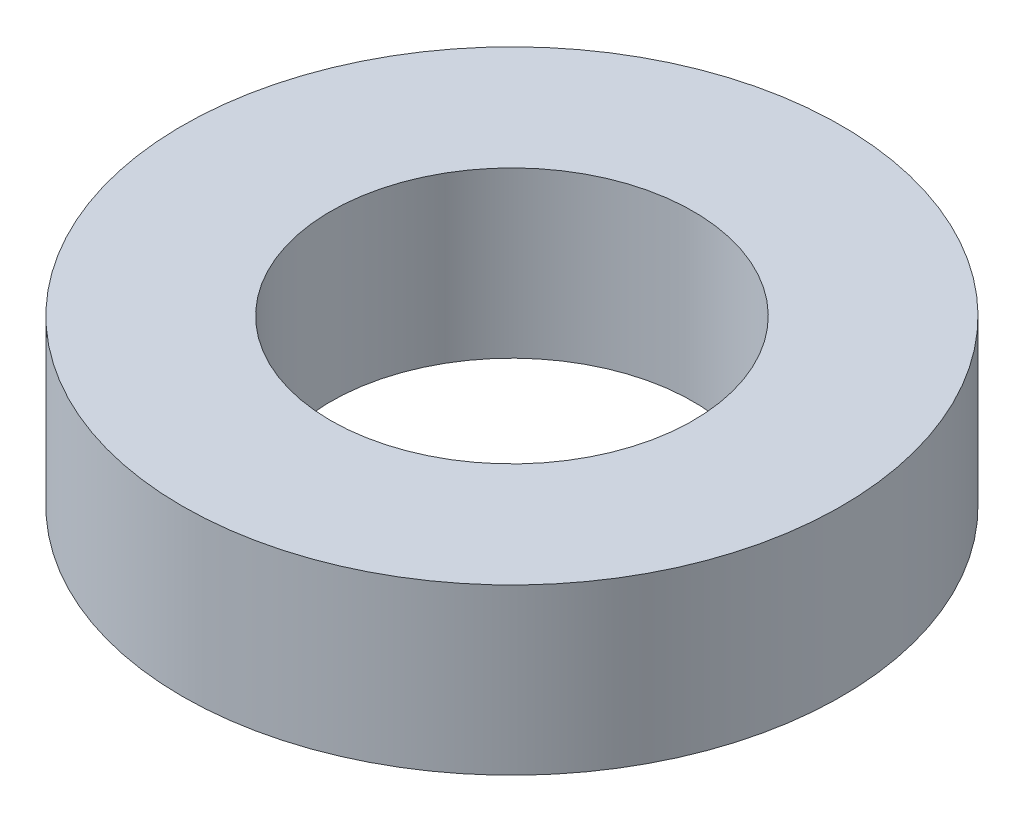
ISO-10303-21;
HEADER;
FILE_DESCRIPTION(('STEP AP214'),'2;1');
FILE_NAME('part.step','',(''),(''),'','','');
FILE_SCHEMA(('AUTOMOTIVE_DESIGN { 1 0 10303 214 1 1 1 1 }'));
ENDSEC;
DATA;
#1=APPLICATION_CONTEXT('core data for automotive mechanical design processes');
#2=APPLICATION_PROTOCOL_DEFINITION('international standard','automotive_design',2000,#1);
#3=PRODUCT_CONTEXT('',#1,'mechanical');
#4=PRODUCT('Part','Part','',(#3));
#5=PRODUCT_RELATED_PRODUCT_CATEGORY('part','',(#4));
#6=PRODUCT_DEFINITION_FORMATION('','',#4);
#7=PRODUCT_DEFINITION_CONTEXT('part definition',#1,'design');
#8=PRODUCT_DEFINITION('design','',#6,#7);
#9=PRODUCT_DEFINITION_SHAPE('','',#8);
#10=(LENGTH_UNIT() NAMED_UNIT(*) SI_UNIT(.MILLI.,.METRE.));
#11=(NAMED_UNIT(*) PLANE_ANGLE_UNIT() SI_UNIT($,.RADIAN.));
#12=(NAMED_UNIT(*) SI_UNIT($,.STERADIAN.) SOLID_ANGLE_UNIT());
#13=UNCERTAINTY_MEASURE_WITH_UNIT(LENGTH_MEASURE(1.E-05),#10,'distance_accuracy_value','');
#14=(GEOMETRIC_REPRESENTATION_CONTEXT(3) GLOBAL_UNCERTAINTY_ASSIGNED_CONTEXT((#13)) GLOBAL_UNIT_ASSIGNED_CONTEXT((#10,
#11,#12)) REPRESENTATION_CONTEXT('',''));
#15=CARTESIAN_POINT('',(0.,0.,0.));
#16=DIRECTION('',(0.,0.,1.));
#17=DIRECTION('',(1.,0.,0.));
#18=AXIS2_PLACEMENT_3D('',#15,#16,#17);
#19=CARTESIAN_POINT('',(0.,0.5,0.));
#20=DIRECTION('',(0.,1.,0.));
#21=DIRECTION('',(0.,0.,1.));
#22=AXIS2_PLACEMENT_3D('',#19,#20,#21);
#23=PLANE('',#22);
#24=CARTESIAN_POINT('',(0.,0.5,0.));
#25=DIRECTION('',(0.,1.,0.));
#26=DIRECTION('',(0.,0.,1.));
#27=AXIS2_PLACEMENT_3D('',#24,#25,#26);
#28=CIRCLE('',#27,2.);
#29=CARTESIAN_POINT('',(0.,0.5,2.));
#30=VERTEX_POINT('',#29);
#31=EDGE_CURVE('E10',#30,#30,#28,.T.);
#32=ORIENTED_EDGE('',*,*,#31,.T.);
#33=EDGE_LOOP('',(#32));
#34=FACE_BOUND('',#33,.T.);
#35=CARTESIAN_POINT('',(0.,0.5,0.));
#36=DIRECTION('',(0.,1.,0.));
#37=DIRECTION('',(0.,0.,1.));
#38=AXIS2_PLACEMENT_3D('',#35,#36,#37);
#39=CIRCLE('',#38,1.1);
#40=CARTESIAN_POINT('',(0.,0.5,1.1));
#41=VERTEX_POINT('',#40);
#42=EDGE_CURVE('E50',#41,#41,#39,.T.);
#43=ORIENTED_EDGE('',*,*,#42,.F.);
#44=EDGE_LOOP('',(#43));
#45=FACE_BOUND('',#44,.T.);
#46=ADVANCED_FACE('F37',(#34,#45),#23,.T.);
#47=CARTESIAN_POINT('',(0.,-0.5,0.));
#48=DIRECTION('',(0.,1.,0.));
#49=DIRECTION('',(0.,0.,1.));
#50=AXIS2_PLACEMENT_3D('',#47,#48,#49);
#51=PLANE('',#50);
#52=CARTESIAN_POINT('',(0.,-0.5,0.));
#53=DIRECTION('',(0.,1.,0.));
#54=DIRECTION('',(0.,0.,1.));
#55=AXIS2_PLACEMENT_3D('',#52,#53,#54);
#56=CIRCLE('',#55,2.);
#57=CARTESIAN_POINT('',(0.,-0.5,2.));
#58=VERTEX_POINT('',#57);
#59=EDGE_CURVE('E41',#58,#58,#56,.T.);
#60=ORIENTED_EDGE('',*,*,#59,.F.);
#61=EDGE_LOOP('',(#60));
#62=FACE_BOUND('',#61,.T.);
#63=CARTESIAN_POINT('',(0.,-0.5,0.));
#64=DIRECTION('',(0.,1.,0.));
#65=DIRECTION('',(0.,0.,1.));
#66=AXIS2_PLACEMENT_3D('',#63,#64,#65);
#67=CIRCLE('',#66,1.1);
#68=CARTESIAN_POINT('',(0.,-0.5,1.1));
#69=VERTEX_POINT('',#68);
#70=EDGE_CURVE('E52',#69,#69,#67,.T.);
#71=ORIENTED_EDGE('',*,*,#70,.T.);
#72=EDGE_LOOP('',(#71));
#73=FACE_BOUND('',#72,.T.);
#74=ADVANCED_FACE('F64',(#62,#73),#51,.F.);
#75=CARTESIAN_POINT('',(0.,0.5,0.));
#76=DIRECTION('',(0.,-1.,0.));
#77=DIRECTION('',(0.,0.,-1.));
#78=AXIS2_PLACEMENT_3D('',#75,#76,#77);
#79=CYLINDRICAL_SURFACE('',#78,2.);
#80=ORIENTED_EDGE('',*,*,#31,.F.);
#81=EDGE_LOOP('',(#80));
#82=FACE_BOUND('',#81,.T.);
#83=ORIENTED_EDGE('',*,*,#59,.T.);
#84=EDGE_LOOP('',(#83));
#85=FACE_BOUND('',#84,.T.);
#86=ADVANCED_FACE('F39',(#82,#85),#79,.T.);
#87=CARTESIAN_POINT('',(0.,0.5,0.));
#88=DIRECTION('',(0.,-1.,0.));
#89=DIRECTION('',(0.,0.,-1.));
#90=AXIS2_PLACEMENT_3D('',#87,#88,#89);
#91=CYLINDRICAL_SURFACE('',#90,1.1);
#92=ORIENTED_EDGE('',*,*,#42,.T.);
#93=EDGE_LOOP('',(#92));
#94=FACE_BOUND('',#93,.T.);
#95=ORIENTED_EDGE('',*,*,#70,.F.);
#96=EDGE_LOOP('',(#95));
#97=FACE_BOUND('',#96,.T.);
#98=ADVANCED_FACE('F60',(#94,#97),#91,.F.);
#99=CLOSED_SHELL('',(#46,#74,#86,#98));
#100=MANIFOLD_SOLID_BREP('B2',#99);
#101=ADVANCED_BREP_SHAPE_REPRESENTATION('',(#18,#100),#14);
#102=SHAPE_DEFINITION_REPRESENTATION(#9,#101);
ENDSEC;
END-ISO-10303-21;
